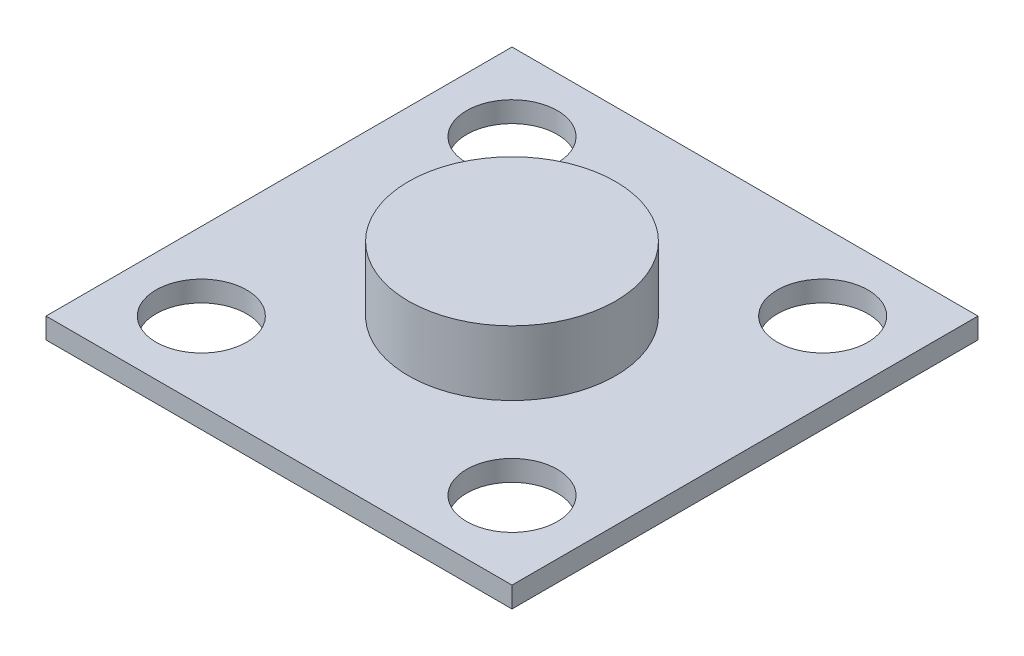
ISO-10303-21;
HEADER;
FILE_DESCRIPTION(('STEP AP214'),'2;1');
FILE_NAME('part.step','',(''),(''),'','','');
FILE_SCHEMA(('AUTOMOTIVE_DESIGN { 1 0 10303 214 1 1 1 1 }'));
ENDSEC;
DATA;
#1=APPLICATION_CONTEXT('core data for automotive mechanical design processes');
#2=APPLICATION_PROTOCOL_DEFINITION('international standard','automotive_design',2000,#1);
#3=PRODUCT_CONTEXT('',#1,'mechanical');
#4=PRODUCT('Part','Part','',(#3));
#5=PRODUCT_RELATED_PRODUCT_CATEGORY('part','',(#4));
#6=PRODUCT_DEFINITION_FORMATION('','',#4);
#7=PRODUCT_DEFINITION_CONTEXT('part definition',#1,'design');
#8=PRODUCT_DEFINITION('design','',#6,#7);
#9=PRODUCT_DEFINITION_SHAPE('','',#8);
#10=(LENGTH_UNIT() NAMED_UNIT(*) SI_UNIT(.MILLI.,.METRE.));
#11=(NAMED_UNIT(*) PLANE_ANGLE_UNIT() SI_UNIT($,.RADIAN.));
#12=(NAMED_UNIT(*) SI_UNIT($,.STERADIAN.) SOLID_ANGLE_UNIT());
#13=UNCERTAINTY_MEASURE_WITH_UNIT(LENGTH_MEASURE(1.E-05),#10,'distance_accuracy_value','');
#14=(GEOMETRIC_REPRESENTATION_CONTEXT(3) GLOBAL_UNCERTAINTY_ASSIGNED_CONTEXT((#13)) GLOBAL_UNIT_ASSIGNED_CONTEXT((#10,
#11,#12)) REPRESENTATION_CONTEXT('',''));
#15=CARTESIAN_POINT('',(0.,0.,0.));
#16=DIRECTION('',(0.,0.,1.));
#17=DIRECTION('',(1.,0.,0.));
#18=AXIS2_PLACEMENT_3D('',#15,#16,#17);
#19=CARTESIAN_POINT('',(0.,0.8,0.));
#20=DIRECTION('',(1.,0.,0.));
#21=DIRECTION('',(0.,0.,-1.));
#22=AXIS2_PLACEMENT_3D('',#19,#20,#21);
#23=PLANE('',#22);
#24=DIRECTION('',(0.,0.,1.));
#25=VECTOR('',#24,1.);
#26=CARTESIAN_POINT('',(0.,0.,0.));
#27=LINE('',#26,#25);
#28=CARTESIAN_POINT('',(0.,0.,-18.));
#29=VERTEX_POINT('',#28);
#30=CARTESIAN_POINT('',(0.,0.,0.));
#31=VERTEX_POINT('',#30);
#32=EDGE_CURVE('E102',#29,#31,#27,.T.);
#33=ORIENTED_EDGE('',*,*,#32,.T.);
#34=DIRECTION('',(0.,-1.,0.));
#35=VECTOR('',#34,1.);
#36=CARTESIAN_POINT('',(0.,0.8,0.));
#37=LINE('',#36,#35);
#38=CARTESIAN_POINT('',(0.,0.8,0.));
#39=VERTEX_POINT('',#38);
#40=EDGE_CURVE('E44',#39,#31,#37,.T.);
#41=ORIENTED_EDGE('',*,*,#40,.F.);
#42=DIRECTION('',(0.,0.,1.));
#43=VECTOR('',#42,1.);
#44=CARTESIAN_POINT('',(0.,0.8,0.));
#45=LINE('',#44,#43);
#46=CARTESIAN_POINT('',(0.,0.8,-18.));
#47=VERTEX_POINT('',#46);
#48=EDGE_CURVE('E88',#47,#39,#45,.T.);
#49=ORIENTED_EDGE('',*,*,#48,.F.);
#50=DIRECTION('',(0.,-1.,0.));
#51=VECTOR('',#50,1.);
#52=CARTESIAN_POINT('',(0.,0.8,-18.));
#53=LINE('',#52,#51);
#54=EDGE_CURVE('E98',#47,#29,#53,.T.);
#55=ORIENTED_EDGE('',*,*,#54,.T.);
#56=EDGE_LOOP('',(#33,#41,#49,#55));
#57=FACE_BOUND('',#56,.T.);
#58=ADVANCED_FACE('F36',(#57),#23,.F.);
#59=CARTESIAN_POINT('',(0.,0.8,0.));
#60=DIRECTION('',(0.,0.,-1.));
#61=DIRECTION('',(-1.,0.,0.));
#62=AXIS2_PLACEMENT_3D('',#59,#60,#61);
#63=PLANE('',#62);
#64=DIRECTION('',(1.,0.,0.));
#65=VECTOR('',#64,1.);
#66=CARTESIAN_POINT('',(0.,0.,0.));
#67=LINE('',#66,#65);
#68=CARTESIAN_POINT('',(18.,0.,0.));
#69=VERTEX_POINT('',#68);
#70=EDGE_CURVE('E93',#31,#69,#67,.T.);
#71=ORIENTED_EDGE('',*,*,#70,.T.);
#72=DIRECTION('',(0.,-1.,0.));
#73=VECTOR('',#72,1.);
#74=CARTESIAN_POINT('',(18.,0.8,0.));
#75=LINE('',#74,#73);
#76=CARTESIAN_POINT('',(18.,0.8,0.));
#77=VERTEX_POINT('',#76);
#78=EDGE_CURVE('E91',#77,#69,#75,.T.);
#79=ORIENTED_EDGE('',*,*,#78,.F.);
#80=DIRECTION('',(1.,0.,0.));
#81=VECTOR('',#80,1.);
#82=CARTESIAN_POINT('',(0.,0.8,0.));
#83=LINE('',#82,#81);
#84=EDGE_CURVE('E83',#39,#77,#83,.T.);
#85=ORIENTED_EDGE('',*,*,#84,.F.);
#86=ORIENTED_EDGE('',*,*,#40,.T.);
#87=EDGE_LOOP('',(#71,#79,#85,#86));
#88=FACE_BOUND('',#87,.T.);
#89=ADVANCED_FACE('F92',(#88),#63,.F.);
#90=CARTESIAN_POINT('',(18.,0.8,0.));
#91=DIRECTION('',(-1.,0.,0.));
#92=DIRECTION('',(0.,0.,1.));
#93=AXIS2_PLACEMENT_3D('',#90,#91,#92);
#94=PLANE('',#93);
#95=DIRECTION('',(0.,0.,-1.));
#96=VECTOR('',#95,1.);
#97=CARTESIAN_POINT('',(18.,0.,0.));
#98=LINE('',#97,#96);
#99=CARTESIAN_POINT('',(18.,0.,-18.));
#100=VERTEX_POINT('',#99);
#101=EDGE_CURVE('E69',#69,#100,#98,.T.);
#102=ORIENTED_EDGE('',*,*,#101,.T.);
#103=DIRECTION('',(0.,-1.,0.));
#104=VECTOR('',#103,1.);
#105=CARTESIAN_POINT('',(18.,0.8,-18.));
#106=LINE('',#105,#104);
#107=CARTESIAN_POINT('',(18.,0.8,-18.));
#108=VERTEX_POINT('',#107);
#109=EDGE_CURVE('E94',#108,#100,#106,.T.);
#110=ORIENTED_EDGE('',*,*,#109,.F.);
#111=DIRECTION('',(0.,0.,-1.));
#112=VECTOR('',#111,1.);
#113=CARTESIAN_POINT('',(18.,0.8,0.));
#114=LINE('',#113,#112);
#115=EDGE_CURVE('E86',#77,#108,#114,.T.);
#116=ORIENTED_EDGE('',*,*,#115,.F.);
#117=ORIENTED_EDGE('',*,*,#78,.T.);
#118=EDGE_LOOP('',(#102,#110,#116,#117));
#119=FACE_BOUND('',#118,.T.);
#120=ADVANCED_FACE('F96',(#119),#94,.F.);
#121=CARTESIAN_POINT('',(0.,0.8,-18.));
#122=DIRECTION('',(0.,0.,1.));
#123=DIRECTION('',(1.,0.,0.));
#124=AXIS2_PLACEMENT_3D('',#121,#122,#123);
#125=PLANE('',#124);
#126=DIRECTION('',(-1.,0.,0.));
#127=VECTOR('',#126,1.);
#128=CARTESIAN_POINT('',(0.,0.,-18.));
#129=LINE('',#128,#127);
#130=EDGE_CURVE('E75',#100,#29,#129,.T.);
#131=ORIENTED_EDGE('',*,*,#130,.T.);
#132=ORIENTED_EDGE('',*,*,#54,.F.);
#133=DIRECTION('',(-1.,0.,0.));
#134=VECTOR('',#133,1.);
#135=CARTESIAN_POINT('',(0.,0.8,-18.));
#136=LINE('',#135,#134);
#137=EDGE_CURVE('E52',#108,#47,#136,.T.);
#138=ORIENTED_EDGE('',*,*,#137,.F.);
#139=ORIENTED_EDGE('',*,*,#109,.T.);
#140=EDGE_LOOP('',(#131,#132,#138,#139));
#141=FACE_BOUND('',#140,.T.);
#142=ADVANCED_FACE('F125',(#141),#125,.F.);
#143=CARTESIAN_POINT('',(0.,0.8,0.));
#144=DIRECTION('',(0.,-1.,0.));
#145=DIRECTION('',(0.,0.,-1.));
#146=AXIS2_PLACEMENT_3D('',#143,#144,#145);
#147=PLANE('',#146);
#148=CARTESIAN_POINT('',(8.99999999999307,0.8,-8.99999999999307));
#149=DIRECTION('',(0.,-1.,0.));
#150=DIRECTION('',(0.,0.,-1.));
#151=AXIS2_PLACEMENT_3D('',#148,#149,#150);
#152=CIRCLE('',#151,4.);
#153=CARTESIAN_POINT('',(8.99999999999307,0.8,-12.9999999999931));
#154=VERTEX_POINT('',#153);
#155=EDGE_CURVE('E11',#154,#154,#152,.F.);
#156=ORIENTED_EDGE('',*,*,#155,.F.);
#157=EDGE_LOOP('',(#156));
#158=FACE_BOUND('',#157,.T.);
#159=CARTESIAN_POINT('',(3.,0.8,-3.));
#160=DIRECTION('',(0.,1.,0.));
#161=DIRECTION('',(0.,0.,1.));
#162=AXIS2_PLACEMENT_3D('',#159,#160,#161);
#163=CIRCLE('',#162,1.75);
#164=CARTESIAN_POINT('',(3.,0.8,-1.25));
#165=VERTEX_POINT('',#164);
#166=EDGE_CURVE('E195',#165,#165,#163,.T.);
#167=ORIENTED_EDGE('',*,*,#166,.F.);
#168=EDGE_LOOP('',(#167));
#169=FACE_BOUND('',#168,.T.);
#170=CARTESIAN_POINT('',(15.,0.8,-3.));
#171=DIRECTION('',(0.,1.,0.));
#172=DIRECTION('',(0.,0.,1.));
#173=AXIS2_PLACEMENT_3D('',#170,#171,#172);
#174=CIRCLE('',#173,1.75);
#175=CARTESIAN_POINT('',(15.,0.8,-1.25));
#176=VERTEX_POINT('',#175);
#177=EDGE_CURVE('E199',#176,#176,#174,.T.);
#178=ORIENTED_EDGE('',*,*,#177,.F.);
#179=EDGE_LOOP('',(#178));
#180=FACE_BOUND('',#179,.T.);
#181=CARTESIAN_POINT('',(15.,0.8,-15.));
#182=DIRECTION('',(0.,1.,0.));
#183=DIRECTION('',(0.,0.,1.));
#184=AXIS2_PLACEMENT_3D('',#181,#182,#183);
#185=CIRCLE('',#184,1.75);
#186=CARTESIAN_POINT('',(15.,0.8,-13.25));
#187=VERTEX_POINT('',#186);
#188=EDGE_CURVE('E212',#187,#187,#185,.T.);
#189=ORIENTED_EDGE('',*,*,#188,.F.);
#190=EDGE_LOOP('',(#189));
#191=FACE_BOUND('',#190,.T.);
#192=CARTESIAN_POINT('',(3.,0.8,-15.));
#193=DIRECTION('',(0.,1.,0.));
#194=DIRECTION('',(0.,0.,1.));
#195=AXIS2_PLACEMENT_3D('',#192,#193,#194);
#196=CIRCLE('',#195,1.75);
#197=CARTESIAN_POINT('',(3.,0.8,-13.25));
#198=VERTEX_POINT('',#197);
#199=EDGE_CURVE('E206',#198,#198,#196,.T.);
#200=ORIENTED_EDGE('',*,*,#199,.F.);
#201=EDGE_LOOP('',(#200));
#202=FACE_BOUND('',#201,.T.);
#203=ORIENTED_EDGE('',*,*,#48,.T.);
#204=ORIENTED_EDGE('',*,*,#84,.T.);
#205=ORIENTED_EDGE('',*,*,#115,.T.);
#206=ORIENTED_EDGE('',*,*,#137,.T.);
#207=EDGE_LOOP('',(#203,#204,#205,#206));
#208=FACE_BOUND('',#207,.T.);
#209=ADVANCED_FACE('F84',(#158,#169,#180,#191,#202,#208),#147,.F.);
#210=CARTESIAN_POINT('',(0.,0.,0.));
#211=DIRECTION('',(0.,-1.,0.));
#212=DIRECTION('',(0.,0.,-1.));
#213=AXIS2_PLACEMENT_3D('',#210,#211,#212);
#214=PLANE('',#213);
#215=CARTESIAN_POINT('',(3.,0.,-3.));
#216=DIRECTION('',(0.,1.,0.));
#217=DIRECTION('',(0.,0.,1.));
#218=AXIS2_PLACEMENT_3D('',#215,#216,#217);
#219=CIRCLE('',#218,1.75);
#220=CARTESIAN_POINT('',(3.,0.,-1.25));
#221=VERTEX_POINT('',#220);
#222=EDGE_CURVE('E192',#221,#221,#219,.T.);
#223=ORIENTED_EDGE('',*,*,#222,.T.);
#224=EDGE_LOOP('',(#223));
#225=FACE_BOUND('',#224,.T.);
#226=CARTESIAN_POINT('',(15.,0.,-3.));
#227=DIRECTION('',(0.,1.,0.));
#228=DIRECTION('',(0.,0.,1.));
#229=AXIS2_PLACEMENT_3D('',#226,#227,#228);
#230=CIRCLE('',#229,1.75);
#231=CARTESIAN_POINT('',(15.,0.,-1.25));
#232=VERTEX_POINT('',#231);
#233=EDGE_CURVE('E217',#232,#232,#230,.T.);
#234=ORIENTED_EDGE('',*,*,#233,.T.);
#235=EDGE_LOOP('',(#234));
#236=FACE_BOUND('',#235,.T.);
#237=CARTESIAN_POINT('',(15.,0.,-15.));
#238=DIRECTION('',(0.,1.,0.));
#239=DIRECTION('',(0.,0.,1.));
#240=AXIS2_PLACEMENT_3D('',#237,#238,#239);
#241=CIRCLE('',#240,1.75);
#242=CARTESIAN_POINT('',(15.,0.,-13.25));
#243=VERTEX_POINT('',#242);
#244=EDGE_CURVE('E208',#243,#243,#241,.T.);
#245=ORIENTED_EDGE('',*,*,#244,.T.);
#246=EDGE_LOOP('',(#245));
#247=FACE_BOUND('',#246,.T.);
#248=CARTESIAN_POINT('',(3.,0.,-15.));
#249=DIRECTION('',(0.,1.,0.));
#250=DIRECTION('',(0.,0.,1.));
#251=AXIS2_PLACEMENT_3D('',#248,#249,#250);
#252=CIRCLE('',#251,1.75);
#253=CARTESIAN_POINT('',(3.,0.,-13.25));
#254=VERTEX_POINT('',#253);
#255=EDGE_CURVE('E105',#254,#254,#252,.T.);
#256=ORIENTED_EDGE('',*,*,#255,.T.);
#257=EDGE_LOOP('',(#256));
#258=FACE_BOUND('',#257,.T.);
#259=ORIENTED_EDGE('',*,*,#32,.F.);
#260=ORIENTED_EDGE('',*,*,#130,.F.);
#261=ORIENTED_EDGE('',*,*,#101,.F.);
#262=ORIENTED_EDGE('',*,*,#70,.F.);
#263=EDGE_LOOP('',(#259,#260,#261,#262));
#264=FACE_BOUND('',#263,.T.);
#265=ADVANCED_FACE('F113',(#225,#236,#247,#258,#264),#214,.T.);
#266=CARTESIAN_POINT('',(3.,0.,-15.));
#267=DIRECTION('',(0.,1.,0.));
#268=DIRECTION('',(0.,0.,1.));
#269=AXIS2_PLACEMENT_3D('',#266,#267,#268);
#270=CYLINDRICAL_SURFACE('',#269,1.75);
#271=ORIENTED_EDGE('',*,*,#255,.F.);
#272=EDGE_LOOP('',(#271));
#273=FACE_BOUND('',#272,.T.);
#274=ORIENTED_EDGE('',*,*,#199,.T.);
#275=EDGE_LOOP('',(#274));
#276=FACE_BOUND('',#275,.T.);
#277=ADVANCED_FACE('F115',(#273,#276),#270,.F.);
#278=CARTESIAN_POINT('',(15.,0.,-15.));
#279=DIRECTION('',(0.,1.,0.));
#280=DIRECTION('',(0.,0.,1.));
#281=AXIS2_PLACEMENT_3D('',#278,#279,#280);
#282=CYLINDRICAL_SURFACE('',#281,1.75);
#283=ORIENTED_EDGE('',*,*,#244,.F.);
#284=EDGE_LOOP('',(#283));
#285=FACE_BOUND('',#284,.T.);
#286=ORIENTED_EDGE('',*,*,#188,.T.);
#287=EDGE_LOOP('',(#286));
#288=FACE_BOUND('',#287,.T.);
#289=ADVANCED_FACE('F122',(#285,#288),#282,.F.);
#290=CARTESIAN_POINT('',(15.,0.,-3.));
#291=DIRECTION('',(0.,1.,0.));
#292=DIRECTION('',(0.,0.,1.));
#293=AXIS2_PLACEMENT_3D('',#290,#291,#292);
#294=CYLINDRICAL_SURFACE('',#293,1.75);
#295=ORIENTED_EDGE('',*,*,#233,.F.);
#296=EDGE_LOOP('',(#295));
#297=FACE_BOUND('',#296,.T.);
#298=ORIENTED_EDGE('',*,*,#177,.T.);
#299=EDGE_LOOP('',(#298));
#300=FACE_BOUND('',#299,.T.);
#301=ADVANCED_FACE('F183',(#297,#300),#294,.F.);
#302=CARTESIAN_POINT('',(3.,0.,-3.));
#303=DIRECTION('',(0.,1.,0.));
#304=DIRECTION('',(0.,0.,1.));
#305=AXIS2_PLACEMENT_3D('',#302,#303,#304);
#306=CYLINDRICAL_SURFACE('',#305,1.75);
#307=ORIENTED_EDGE('',*,*,#222,.F.);
#308=EDGE_LOOP('',(#307));
#309=FACE_BOUND('',#308,.T.);
#310=ORIENTED_EDGE('',*,*,#166,.T.);
#311=EDGE_LOOP('',(#310));
#312=FACE_BOUND('',#311,.T.);
#313=ADVANCED_FACE('F155',(#309,#312),#306,.F.);
#314=CARTESIAN_POINT('',(8.99999999999307,3.3,-8.99999999999307));
#315=DIRECTION('',(0.,-1.,0.));
#316=DIRECTION('',(0.,0.,-1.));
#317=AXIS2_PLACEMENT_3D('',#314,#315,#316);
#318=CYLINDRICAL_SURFACE('',#317,4.);
#319=CARTESIAN_POINT('',(8.99999999999307,3.3,-8.99999999999307));
#320=DIRECTION('',(0.,1.,0.));
#321=DIRECTION('',(0.,0.,1.));
#322=AXIS2_PLACEMENT_3D('',#319,#320,#321);
#323=CIRCLE('',#322,4.);
#324=CARTESIAN_POINT('',(8.99999999999307,3.3,-4.99999999999307));
#325=VERTEX_POINT('',#324);
#326=EDGE_CURVE('E197',#325,#325,#323,.T.);
#327=ORIENTED_EDGE('',*,*,#326,.F.);
#328=EDGE_LOOP('',(#327));
#329=FACE_BOUND('',#328,.T.);
#330=ORIENTED_EDGE('',*,*,#155,.T.);
#331=EDGE_LOOP('',(#330));
#332=FACE_BOUND('',#331,.T.);
#333=ADVANCED_FACE('F160',(#329,#332),#318,.T.);
#334=CARTESIAN_POINT('',(8.99999999999307,3.3,-8.99999999999307));
#335=DIRECTION('',(0.,1.,0.));
#336=DIRECTION('',(0.,0.,1.));
#337=AXIS2_PLACEMENT_3D('',#334,#335,#336);
#338=PLANE('',#337);
#339=ORIENTED_EDGE('',*,*,#326,.T.);
#340=EDGE_LOOP('',(#339));
#341=FACE_BOUND('',#340,.T.);
#342=ADVANCED_FACE('F165',(#341),#338,.T.);
#343=CLOSED_SHELL('',(#58,#89,#120,#142,#209,#265,#277,#289,#301,#313,#333,#342));
#344=MANIFOLD_SOLID_BREP('B2',#343);
#345=ADVANCED_BREP_SHAPE_REPRESENTATION('',(#18,#344),#14);
#346=SHAPE_DEFINITION_REPRESENTATION(#9,#345);
ENDSEC;
END-ISO-10303-21;
